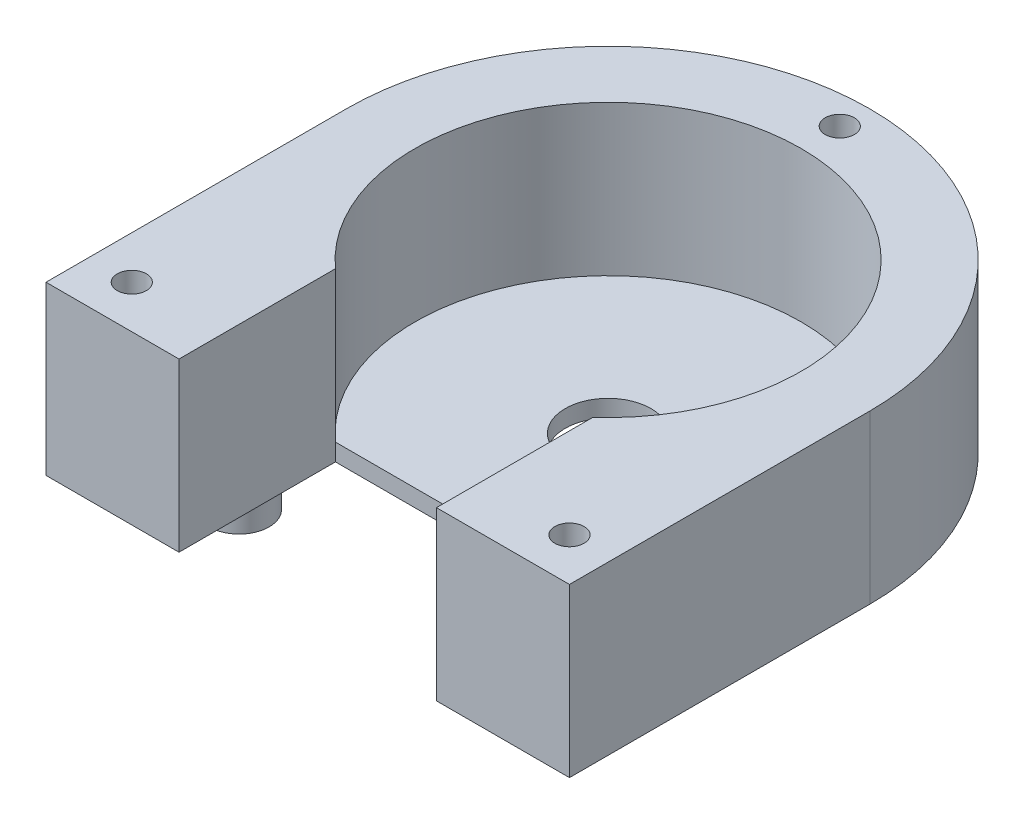
ISO-10303-21;
HEADER;
FILE_DESCRIPTION(('STEP AP214'),'2;1');
FILE_NAME('part.step','',(''),(''),'','','');
FILE_SCHEMA(('AUTOMOTIVE_DESIGN { 1 0 10303 214 1 1 1 1 }'));
ENDSEC;
DATA;
#1=APPLICATION_CONTEXT('core data for automotive mechanical design processes');
#2=APPLICATION_PROTOCOL_DEFINITION('international standard','automotive_design',2000,#1);
#3=PRODUCT_CONTEXT('',#1,'mechanical');
#4=PRODUCT('Part','Part','',(#3));
#5=PRODUCT_RELATED_PRODUCT_CATEGORY('part','',(#4));
#6=PRODUCT_DEFINITION_FORMATION('','',#4);
#7=PRODUCT_DEFINITION_CONTEXT('part definition',#1,'design');
#8=PRODUCT_DEFINITION('design','',#6,#7);
#9=PRODUCT_DEFINITION_SHAPE('','',#8);
#10=(LENGTH_UNIT() NAMED_UNIT(*) SI_UNIT(.MILLI.,.METRE.));
#11=(NAMED_UNIT(*) PLANE_ANGLE_UNIT() SI_UNIT($,.RADIAN.));
#12=(NAMED_UNIT(*) SI_UNIT($,.STERADIAN.) SOLID_ANGLE_UNIT());
#13=UNCERTAINTY_MEASURE_WITH_UNIT(LENGTH_MEASURE(1.E-05),#10,'distance_accuracy_value','');
#14=(GEOMETRIC_REPRESENTATION_CONTEXT(3) GLOBAL_UNCERTAINTY_ASSIGNED_CONTEXT((#13)) GLOBAL_UNIT_ASSIGNED_CONTEXT((#10,
#11,#12)) REPRESENTATION_CONTEXT('',''));
#15=CARTESIAN_POINT('',(0.,0.,0.));
#16=DIRECTION('',(0.,0.,1.));
#17=DIRECTION('',(1.,0.,0.));
#18=AXIS2_PLACEMENT_3D('',#15,#16,#17);
#19=CARTESIAN_POINT('',(0.,0.,0.));
#20=DIRECTION('',(0.,1.,0.));
#21=DIRECTION('',(0.,0.,1.));
#22=AXIS2_PLACEMENT_3D('',#19,#20,#21);
#23=PLANE('',#22);
#24=CARTESIAN_POINT('',(0.,0.,-27.));
#25=DIRECTION('',(0.,1.,0.));
#26=DIRECTION('',(0.,0.,1.));
#27=AXIS2_PLACEMENT_3D('',#24,#25,#26);
#28=CIRCLE('',#27,1.7);
#29=CARTESIAN_POINT('',(0.,0.,-25.3));
#30=VERTEX_POINT('',#29);
#31=EDGE_CURVE('E656',#30,#30,#28,.F.);
#32=ORIENTED_EDGE('',*,*,#31,.T.);
#33=EDGE_LOOP('',(#32));
#34=FACE_BOUND('',#33,.T.);
#35=CARTESIAN_POINT('',(25.5,0.,30.));
#36=DIRECTION('',(0.,1.,0.));
#37=DIRECTION('',(0.,0.,1.));
#38=AXIS2_PLACEMENT_3D('',#35,#36,#37);
#39=CIRCLE('',#38,1.7);
#40=CARTESIAN_POINT('',(25.5,0.,31.7));
#41=VERTEX_POINT('',#40);
#42=EDGE_CURVE('E669',#41,#41,#39,.F.);
#43=ORIENTED_EDGE('',*,*,#42,.T.);
#44=EDGE_LOOP('',(#43));
#45=FACE_BOUND('',#44,.T.);
#46=DIRECTION('',(0.,0.,1.));
#47=VECTOR('',#46,1.);
#48=CARTESIAN_POINT('',(15.,0.,0.));
#49=LINE('',#48,#47);
#50=CARTESIAN_POINT('',(15.,0.,16.7705098312484));
#51=VERTEX_POINT('',#50);
#52=CARTESIAN_POINT('',(15.,0.,35.));
#53=VERTEX_POINT('',#52);
#54=EDGE_CURVE('E238',#51,#53,#49,.T.);
#55=ORIENTED_EDGE('',*,*,#54,.T.);
#56=DIRECTION('',(-1.,0.,0.));
#57=VECTOR('',#56,1.);
#58=CARTESIAN_POINT('',(0.,0.,35.));
#59=LINE('',#58,#57);
#60=CARTESIAN_POINT('',(30.5,0.,35.));
#61=VERTEX_POINT('',#60);
#62=EDGE_CURVE('E230',#61,#53,#59,.T.);
#63=ORIENTED_EDGE('',*,*,#62,.F.);
#64=DIRECTION('',(0.,0.,1.));
#65=VECTOR('',#64,1.);
#66=CARTESIAN_POINT('',(30.5,0.,0.));
#67=LINE('',#66,#65);
#68=CARTESIAN_POINT('',(30.5,0.,0.));
#69=VERTEX_POINT('',#68);
#70=EDGE_CURVE('E237',#69,#61,#67,.T.);
#71=ORIENTED_EDGE('',*,*,#70,.F.);
#72=CARTESIAN_POINT('',(0.,0.,0.));
#73=DIRECTION('',(0.,1.,0.));
#74=DIRECTION('',(0.,0.,1.));
#75=AXIS2_PLACEMENT_3D('',#72,#73,#74);
#76=CIRCLE('',#75,30.5);
#77=CARTESIAN_POINT('',(-30.5,0.,0.));
#78=VERTEX_POINT('',#77);
#79=EDGE_CURVE('E249',#69,#78,#76,.T.);
#80=ORIENTED_EDGE('',*,*,#79,.T.);
#81=DIRECTION('',(0.,0.,-1.));
#82=VECTOR('',#81,1.);
#83=CARTESIAN_POINT('',(-30.5,0.,0.));
#84=LINE('',#83,#82);
#85=CARTESIAN_POINT('',(-30.5,0.,35.));
#86=VERTEX_POINT('',#85);
#87=EDGE_CURVE('E123',#86,#78,#84,.T.);
#88=ORIENTED_EDGE('',*,*,#87,.F.);
#89=DIRECTION('',(-1.,0.,0.));
#90=VECTOR('',#89,1.);
#91=CARTESIAN_POINT('',(0.,0.,35.));
#92=LINE('',#91,#90);
#93=CARTESIAN_POINT('',(-15.,0.,35.));
#94=VERTEX_POINT('',#93);
#95=EDGE_CURVE('E119',#94,#86,#92,.T.);
#96=ORIENTED_EDGE('',*,*,#95,.F.);
#97=DIRECTION('',(0.,0.,1.));
#98=VECTOR('',#97,1.);
#99=CARTESIAN_POINT('',(-15.,0.,0.));
#100=LINE('',#99,#98);
#101=CARTESIAN_POINT('',(-15.,0.,16.7705098312484));
#102=VERTEX_POINT('',#101);
#103=EDGE_CURVE('E102',#102,#94,#100,.T.);
#104=ORIENTED_EDGE('',*,*,#103,.F.);
#105=CARTESIAN_POINT('',(0.,0.,0.));
#106=DIRECTION('',(0.,1.,0.));
#107=DIRECTION('',(0.,0.,1.));
#108=AXIS2_PLACEMENT_3D('',#105,#106,#107);
#109=CIRCLE('',#108,22.5);
#110=EDGE_CURVE('E92',#51,#102,#109,.T.);
#111=ORIENTED_EDGE('',*,*,#110,.F.);
#112=EDGE_LOOP('',(#55,#63,#71,#80,#88,#96,#104,#111));
#113=FACE_BOUND('',#112,.T.);
#114=CARTESIAN_POINT('',(-25.5000000000002,0.,30.));
#115=DIRECTION('',(0.,1.,0.));
#116=DIRECTION('',(0.,0.,1.));
#117=AXIS2_PLACEMENT_3D('',#114,#115,#116);
#118=CIRCLE('',#117,1.7);
#119=CARTESIAN_POINT('',(-25.5000000000002,0.,31.7));
#120=VERTEX_POINT('',#119);
#121=EDGE_CURVE('E686',#120,#120,#118,.F.);
#122=ORIENTED_EDGE('',*,*,#121,.T.);
#123=EDGE_LOOP('',(#122));
#124=FACE_BOUND('',#123,.T.);
#125=ADVANCED_FACE('F46',(#34,#45,#113,#124),#23,.T.);
#126=CARTESIAN_POINT('',(0.,-19.5,0.));
#127=DIRECTION('',(0.,-1.,0.));
#128=DIRECTION('',(0.,0.,-1.));
#129=AXIS2_PLACEMENT_3D('',#126,#127,#128);
#130=PLANE('',#129);
#131=CARTESIAN_POINT('',(0.,-19.5,-27.));
#132=DIRECTION('',(0.,-1.,0.));
#133=DIRECTION('',(0.,0.,-1.));
#134=AXIS2_PLACEMENT_3D('',#131,#132,#133);
#135=CIRCLE('',#134,3.25);
#136=CARTESIAN_POINT('',(0.,-19.5,-30.25));
#137=VERTEX_POINT('',#136);
#138=EDGE_CURVE('E654',#137,#137,#135,.T.);
#139=ORIENTED_EDGE('',*,*,#138,.F.);
#140=EDGE_LOOP('',(#139));
#141=FACE_BOUND('',#140,.T.);
#142=CARTESIAN_POINT('',(25.5,-19.5,30.));
#143=DIRECTION('',(0.,-1.,0.));
#144=DIRECTION('',(0.,0.,-1.));
#145=AXIS2_PLACEMENT_3D('',#142,#143,#144);
#146=CIRCLE('',#145,3.25);
#147=CARTESIAN_POINT('',(25.5,-19.5,26.75));
#148=VERTEX_POINT('',#147);
#149=EDGE_CURVE('E674',#148,#148,#146,.T.);
#150=ORIENTED_EDGE('',*,*,#149,.F.);
#151=EDGE_LOOP('',(#150));
#152=FACE_BOUND('',#151,.T.);
#153=CARTESIAN_POINT('',(-25.5000000000002,-19.5,30.));
#154=DIRECTION('',(0.,-1.,0.));
#155=DIRECTION('',(0.,0.,-1.));
#156=AXIS2_PLACEMENT_3D('',#153,#154,#155);
#157=CIRCLE('',#156,3.25);
#158=CARTESIAN_POINT('',(-25.5000000000002,-19.5,26.75));
#159=VERTEX_POINT('',#158);
#160=EDGE_CURVE('E673',#159,#159,#157,.T.);
#161=ORIENTED_EDGE('',*,*,#160,.F.);
#162=EDGE_LOOP('',(#161));
#163=FACE_BOUND('',#162,.T.);
#164=CARTESIAN_POINT('',(-19.9999999999999,-19.5,-15.0000000000002));
#165=DIRECTION('',(0.,-1.,0.));
#166=DIRECTION('',(0.,0.,-1.));
#167=AXIS2_PLACEMENT_3D('',#164,#165,#166);
#168=CIRCLE('',#167,3.50000000000001);
#169=CARTESIAN_POINT('',(-19.9999999999999,-19.5,-18.5000000000002));
#170=VERTEX_POINT('',#169);
#171=EDGE_CURVE('E11',#170,#170,#168,.T.);
#172=ORIENTED_EDGE('',*,*,#171,.F.);
#173=EDGE_LOOP('',(#172));
#174=FACE_BOUND('',#173,.T.);
#175=CARTESIAN_POINT('',(20.,-19.5,23.));
#176=DIRECTION('',(0.,-1.,0.));
#177=DIRECTION('',(0.,0.,-1.));
#178=AXIS2_PLACEMENT_3D('',#175,#176,#177);
#179=CIRCLE('',#178,3.5);
#180=CARTESIAN_POINT('',(20.,-19.5,19.5));
#181=VERTEX_POINT('',#180);
#182=EDGE_CURVE('E702',#181,#181,#179,.T.);
#183=ORIENTED_EDGE('',*,*,#182,.F.);
#184=EDGE_LOOP('',(#183));
#185=FACE_BOUND('',#184,.T.);
#186=CARTESIAN_POINT('',(-20.0000000000002,-19.5,23.));
#187=DIRECTION('',(0.,-1.,0.));
#188=DIRECTION('',(0.,0.,-1.));
#189=AXIS2_PLACEMENT_3D('',#186,#187,#188);
#190=CIRCLE('',#189,3.50000000000001);
#191=CARTESIAN_POINT('',(-20.0000000000002,-19.5,19.5));
#192=VERTEX_POINT('',#191);
#193=EDGE_CURVE('E128',#192,#192,#190,.T.);
#194=ORIENTED_EDGE('',*,*,#193,.F.);
#195=EDGE_LOOP('',(#194));
#196=FACE_BOUND('',#195,.T.);
#197=CARTESIAN_POINT('',(0.,-19.5,0.));
#198=DIRECTION('',(0.,-1.,0.));
#199=DIRECTION('',(0.,0.,-1.));
#200=AXIS2_PLACEMENT_3D('',#197,#198,#199);
#201=CIRCLE('',#200,5.);
#202=CARTESIAN_POINT('',(0.,-19.5,-5.));
#203=VERTEX_POINT('',#202);
#204=EDGE_CURVE('E306',#203,#203,#201,.T.);
#205=ORIENTED_EDGE('',*,*,#204,.F.);
#206=EDGE_LOOP('',(#205));
#207=FACE_BOUND('',#206,.T.);
#208=DIRECTION('',(1.,0.,0.));
#209=VECTOR('',#208,1.);
#210=CARTESIAN_POINT('',(0.,-19.5,16.7705098312484));
#211=LINE('',#210,#209);
#212=CARTESIAN_POINT('',(-15.,-19.5,16.7705098312484));
#213=VERTEX_POINT('',#212);
#214=CARTESIAN_POINT('',(15.,-19.5,16.7705098312484));
#215=VERTEX_POINT('',#214);
#216=EDGE_CURVE('E311',#213,#215,#211,.T.);
#217=ORIENTED_EDGE('',*,*,#216,.F.);
#218=DIRECTION('',(0.,0.,1.));
#219=VECTOR('',#218,1.);
#220=CARTESIAN_POINT('',(-15.,-19.5,0.));
#221=LINE('',#220,#219);
#222=CARTESIAN_POINT('',(-15.,-19.5,35.));
#223=VERTEX_POINT('',#222);
#224=EDGE_CURVE('E283',#213,#223,#221,.T.);
#225=ORIENTED_EDGE('',*,*,#224,.T.);
#226=DIRECTION('',(-1.,0.,0.));
#227=VECTOR('',#226,1.);
#228=CARTESIAN_POINT('',(0.,-19.5,35.));
#229=LINE('',#228,#227);
#230=CARTESIAN_POINT('',(-30.5,-19.5,35.));
#231=VERTEX_POINT('',#230);
#232=EDGE_CURVE('E279',#223,#231,#229,.T.);
#233=ORIENTED_EDGE('',*,*,#232,.T.);
#234=DIRECTION('',(0.,0.,-1.));
#235=VECTOR('',#234,1.);
#236=CARTESIAN_POINT('',(-30.5,-19.5,0.));
#237=LINE('',#236,#235);
#238=CARTESIAN_POINT('',(-30.5,-19.5,0.));
#239=VERTEX_POINT('',#238);
#240=EDGE_CURVE('E272',#231,#239,#237,.T.);
#241=ORIENTED_EDGE('',*,*,#240,.T.);
#242=CARTESIAN_POINT('',(0.,-19.5,0.));
#243=DIRECTION('',(0.,-1.,0.));
#244=DIRECTION('',(0.,0.,-1.));
#245=AXIS2_PLACEMENT_3D('',#242,#243,#244);
#246=CIRCLE('',#245,30.5);
#247=CARTESIAN_POINT('',(30.5,-19.5,0.));
#248=VERTEX_POINT('',#247);
#249=EDGE_CURVE('E264',#239,#248,#246,.T.);
#250=ORIENTED_EDGE('',*,*,#249,.T.);
#251=DIRECTION('',(0.,0.,1.));
#252=VECTOR('',#251,1.);
#253=CARTESIAN_POINT('',(30.5,-19.5,0.));
#254=LINE('',#253,#252);
#255=CARTESIAN_POINT('',(30.5,-19.5,35.));
#256=VERTEX_POINT('',#255);
#257=EDGE_CURVE('E271',#248,#256,#254,.T.);
#258=ORIENTED_EDGE('',*,*,#257,.T.);
#259=DIRECTION('',(-1.,0.,0.));
#260=VECTOR('',#259,1.);
#261=CARTESIAN_POINT('',(0.,-19.5,35.));
#262=LINE('',#261,#260);
#263=CARTESIAN_POINT('',(15.,-19.5,35.));
#264=VERTEX_POINT('',#263);
#265=EDGE_CURVE('E289',#256,#264,#262,.T.);
#266=ORIENTED_EDGE('',*,*,#265,.T.);
#267=DIRECTION('',(0.,0.,-1.));
#268=VECTOR('',#267,1.);
#269=CARTESIAN_POINT('',(15.,-19.5,0.));
#270=LINE('',#269,#268);
#271=EDGE_CURVE('E293',#264,#215,#270,.T.);
#272=ORIENTED_EDGE('',*,*,#271,.T.);
#273=EDGE_LOOP('',(#217,#225,#233,#241,#250,#258,#266,#272));
#274=FACE_BOUND('',#273,.T.);
#275=CARTESIAN_POINT('',(20.,-19.5,-15.));
#276=DIRECTION('',(0.,-1.,0.));
#277=DIRECTION('',(0.,0.,-1.));
#278=AXIS2_PLACEMENT_3D('',#275,#276,#277);
#279=CIRCLE('',#278,3.5);
#280=CARTESIAN_POINT('',(20.,-19.5,-18.5));
#281=VERTEX_POINT('',#280);
#282=EDGE_CURVE('E715',#281,#281,#279,.T.);
#283=ORIENTED_EDGE('',*,*,#282,.F.);
#284=EDGE_LOOP('',(#283));
#285=FACE_BOUND('',#284,.T.);
#286=ADVANCED_FACE('F167',(#141,#152,#163,#174,#185,#196,#207,#274,#285),#130,.T.);
#287=CARTESIAN_POINT('',(15.,-17.5,0.));
#288=DIRECTION('',(-1.,0.,0.));
#289=DIRECTION('',(0.,0.,1.));
#290=AXIS2_PLACEMENT_3D('',#287,#288,#289);
#291=PLANE('',#290);
#292=ORIENTED_EDGE('',*,*,#54,.F.);
#293=DIRECTION('',(0.,1.,0.));
#294=VECTOR('',#293,1.);
#295=CARTESIAN_POINT('',(15.,-17.5,16.7705098312484));
#296=LINE('',#295,#294);
#297=CARTESIAN_POINT('',(15.,-17.5,16.7705098312484));
#298=VERTEX_POINT('',#297);
#299=EDGE_CURVE('E63',#298,#51,#296,.T.);
#300=ORIENTED_EDGE('',*,*,#299,.F.);
#301=DIRECTION('',(0.,1.,0.));
#302=VECTOR('',#301,1.);
#303=CARTESIAN_POINT('',(15.,-19.5,16.7705098312484));
#304=LINE('',#303,#302);
#305=EDGE_CURVE('E243',#215,#298,#304,.T.);
#306=ORIENTED_EDGE('',*,*,#305,.F.);
#307=ORIENTED_EDGE('',*,*,#271,.F.);
#308=DIRECTION('',(0.,1.,0.));
#309=VECTOR('',#308,1.);
#310=CARTESIAN_POINT('',(15.,-17.5,35.));
#311=LINE('',#310,#309);
#312=EDGE_CURVE('E146',#264,#53,#311,.T.);
#313=ORIENTED_EDGE('',*,*,#312,.T.);
#314=EDGE_LOOP('',(#292,#300,#306,#307,#313));
#315=FACE_BOUND('',#314,.T.);
#316=ADVANCED_FACE('F48',(#315),#291,.T.);
#317=CARTESIAN_POINT('',(0.,-17.5,0.));
#318=DIRECTION('',(0.,1.,0.));
#319=DIRECTION('',(0.,0.,1.));
#320=AXIS2_PLACEMENT_3D('',#317,#318,#319);
#321=CYLINDRICAL_SURFACE('',#320,22.5);
#322=ORIENTED_EDGE('',*,*,#110,.T.);
#323=DIRECTION('',(0.,1.,0.));
#324=VECTOR('',#323,1.);
#325=CARTESIAN_POINT('',(-15.,-17.5,16.7705098312484));
#326=LINE('',#325,#324);
#327=CARTESIAN_POINT('',(-15.,-17.5,16.7705098312484));
#328=VERTEX_POINT('',#327);
#329=EDGE_CURVE('E95',#328,#102,#326,.T.);
#330=ORIENTED_EDGE('',*,*,#329,.F.);
#331=CARTESIAN_POINT('',(0.,-17.5,0.));
#332=DIRECTION('',(0.,1.,0.));
#333=DIRECTION('',(0.,0.,1.));
#334=AXIS2_PLACEMENT_3D('',#331,#332,#333);
#335=CIRCLE('',#334,22.5);
#336=EDGE_CURVE('E101',#298,#328,#335,.T.);
#337=ORIENTED_EDGE('',*,*,#336,.F.);
#338=ORIENTED_EDGE('',*,*,#299,.T.);
#339=EDGE_LOOP('',(#322,#330,#337,#338));
#340=FACE_BOUND('',#339,.T.);
#341=ADVANCED_FACE('F94',(#340),#321,.F.);
#342=CARTESIAN_POINT('',(-15.,-17.5,0.));
#343=DIRECTION('',(-1.,0.,0.));
#344=DIRECTION('',(0.,0.,1.));
#345=AXIS2_PLACEMENT_3D('',#342,#343,#344);
#346=PLANE('',#345);
#347=ORIENTED_EDGE('',*,*,#103,.T.);
#348=DIRECTION('',(0.,1.,0.));
#349=VECTOR('',#348,1.);
#350=CARTESIAN_POINT('',(-15.,-17.5,35.));
#351=LINE('',#350,#349);
#352=EDGE_CURVE('E114',#223,#94,#351,.T.);
#353=ORIENTED_EDGE('',*,*,#352,.F.);
#354=ORIENTED_EDGE('',*,*,#224,.F.);
#355=DIRECTION('',(0.,1.,0.));
#356=VECTOR('',#355,1.);
#357=CARTESIAN_POINT('',(-15.,-19.5,16.7705098312484));
#358=LINE('',#357,#356);
#359=EDGE_CURVE('E111',#213,#328,#358,.T.);
#360=ORIENTED_EDGE('',*,*,#359,.T.);
#361=ORIENTED_EDGE('',*,*,#329,.T.);
#362=EDGE_LOOP('',(#347,#353,#354,#360,#361));
#363=FACE_BOUND('',#362,.T.);
#364=ADVANCED_FACE('F106',(#363),#346,.F.);
#365=CARTESIAN_POINT('',(0.,-17.5,35.));
#366=DIRECTION('',(0.,0.,-1.));
#367=DIRECTION('',(-1.,0.,0.));
#368=AXIS2_PLACEMENT_3D('',#365,#366,#367);
#369=PLANE('',#368);
#370=ORIENTED_EDGE('',*,*,#95,.T.);
#371=DIRECTION('',(0.,1.,0.));
#372=VECTOR('',#371,1.);
#373=CARTESIAN_POINT('',(-30.5,-17.5,35.));
#374=LINE('',#373,#372);
#375=EDGE_CURVE('E132',#231,#86,#374,.T.);
#376=ORIENTED_EDGE('',*,*,#375,.F.);
#377=ORIENTED_EDGE('',*,*,#232,.F.);
#378=ORIENTED_EDGE('',*,*,#352,.T.);
#379=EDGE_LOOP('',(#370,#376,#377,#378));
#380=FACE_BOUND('',#379,.T.);
#381=ADVANCED_FACE('F203',(#380),#369,.F.);
#382=CARTESIAN_POINT('',(-30.5,-17.5,0.));
#383=DIRECTION('',(1.,0.,0.));
#384=DIRECTION('',(0.,0.,-1.));
#385=AXIS2_PLACEMENT_3D('',#382,#383,#384);
#386=PLANE('',#385);
#387=ORIENTED_EDGE('',*,*,#87,.T.);
#388=DIRECTION('',(0.,1.,0.));
#389=VECTOR('',#388,1.);
#390=CARTESIAN_POINT('',(-30.5,-17.5,0.));
#391=LINE('',#390,#389);
#392=EDGE_CURVE('E136',#239,#78,#391,.T.);
#393=ORIENTED_EDGE('',*,*,#392,.F.);
#394=ORIENTED_EDGE('',*,*,#240,.F.);
#395=ORIENTED_EDGE('',*,*,#375,.T.);
#396=EDGE_LOOP('',(#387,#393,#394,#395));
#397=FACE_BOUND('',#396,.T.);
#398=ADVANCED_FACE('F206',(#397),#386,.F.);
#399=CARTESIAN_POINT('',(0.,-17.5,0.));
#400=DIRECTION('',(0.,1.,0.));
#401=DIRECTION('',(0.,0.,1.));
#402=AXIS2_PLACEMENT_3D('',#399,#400,#401);
#403=CYLINDRICAL_SURFACE('',#402,30.5);
#404=ORIENTED_EDGE('',*,*,#79,.F.);
#405=DIRECTION('',(0.,1.,0.));
#406=VECTOR('',#405,1.);
#407=CARTESIAN_POINT('',(30.5,-17.5,0.));
#408=LINE('',#407,#406);
#409=EDGE_CURVE('E139',#248,#69,#408,.T.);
#410=ORIENTED_EDGE('',*,*,#409,.F.);
#411=ORIENTED_EDGE('',*,*,#249,.F.);
#412=ORIENTED_EDGE('',*,*,#392,.T.);
#413=EDGE_LOOP('',(#404,#410,#411,#412));
#414=FACE_BOUND('',#413,.T.);
#415=ADVANCED_FACE('F210',(#414),#403,.T.);
#416=CARTESIAN_POINT('',(30.5,-17.5,0.));
#417=DIRECTION('',(-1.,0.,0.));
#418=DIRECTION('',(0.,0.,1.));
#419=AXIS2_PLACEMENT_3D('',#416,#417,#418);
#420=PLANE('',#419);
#421=ORIENTED_EDGE('',*,*,#70,.T.);
#422=DIRECTION('',(0.,1.,0.));
#423=VECTOR('',#422,1.);
#424=CARTESIAN_POINT('',(30.5,-17.5,35.));
#425=LINE('',#424,#423);
#426=EDGE_CURVE('E142',#256,#61,#425,.T.);
#427=ORIENTED_EDGE('',*,*,#426,.F.);
#428=ORIENTED_EDGE('',*,*,#257,.F.);
#429=ORIENTED_EDGE('',*,*,#409,.T.);
#430=EDGE_LOOP('',(#421,#427,#428,#429));
#431=FACE_BOUND('',#430,.T.);
#432=ADVANCED_FACE('F214',(#431),#420,.F.);
#433=CARTESIAN_POINT('',(0.,-17.5,35.));
#434=DIRECTION('',(0.,0.,-1.));
#435=DIRECTION('',(-1.,0.,0.));
#436=AXIS2_PLACEMENT_3D('',#433,#434,#435);
#437=PLANE('',#436);
#438=ORIENTED_EDGE('',*,*,#62,.T.);
#439=ORIENTED_EDGE('',*,*,#312,.F.);
#440=ORIENTED_EDGE('',*,*,#265,.F.);
#441=ORIENTED_EDGE('',*,*,#426,.T.);
#442=EDGE_LOOP('',(#438,#439,#440,#441));
#443=FACE_BOUND('',#442,.T.);
#444=ADVANCED_FACE('F217',(#443),#437,.F.);
#445=CARTESIAN_POINT('',(0.,-17.5,0.));
#446=DIRECTION('',(0.,-1.,0.));
#447=DIRECTION('',(0.,0.,-1.));
#448=AXIS2_PLACEMENT_3D('',#445,#446,#447);
#449=PLANE('',#448);
#450=CARTESIAN_POINT('',(0.,-17.5,0.));
#451=DIRECTION('',(0.,-1.,0.));
#452=DIRECTION('',(0.,0.,-1.));
#453=AXIS2_PLACEMENT_3D('',#450,#451,#452);
#454=CIRCLE('',#453,5.);
#455=CARTESIAN_POINT('',(0.,-17.5,-5.));
#456=VERTEX_POINT('',#455);
#457=EDGE_CURVE('E297',#456,#456,#454,.T.);
#458=ORIENTED_EDGE('',*,*,#457,.T.);
#459=EDGE_LOOP('',(#458));
#460=FACE_BOUND('',#459,.T.);
#461=DIRECTION('',(1.,0.,0.));
#462=VECTOR('',#461,1.);
#463=CARTESIAN_POINT('',(0.,-17.5,16.7705098312484));
#464=LINE('',#463,#462);
#465=EDGE_CURVE('E301',#328,#298,#464,.T.);
#466=ORIENTED_EDGE('',*,*,#465,.T.);
#467=ORIENTED_EDGE('',*,*,#336,.T.);
#468=EDGE_LOOP('',(#466,#467));
#469=FACE_BOUND('',#468,.T.);
#470=ADVANCED_FACE('F220',(#460,#469),#449,.F.);
#471=CARTESIAN_POINT('',(0.,-19.5,16.7705098312484));
#472=DIRECTION('',(0.,0.,1.));
#473=DIRECTION('',(1.,0.,0.));
#474=AXIS2_PLACEMENT_3D('',#471,#472,#473);
#475=PLANE('',#474);
#476=ORIENTED_EDGE('',*,*,#465,.F.);
#477=ORIENTED_EDGE('',*,*,#359,.F.);
#478=ORIENTED_EDGE('',*,*,#216,.T.);
#479=ORIENTED_EDGE('',*,*,#305,.T.);
#480=EDGE_LOOP('',(#476,#477,#478,#479));
#481=FACE_BOUND('',#480,.T.);
#482=ADVANCED_FACE('F225',(#481),#475,.T.);
#483=CARTESIAN_POINT('',(0.,-19.5,0.));
#484=DIRECTION('',(0.,1.,0.));
#485=DIRECTION('',(0.,0.,1.));
#486=AXIS2_PLACEMENT_3D('',#483,#484,#485);
#487=CYLINDRICAL_SURFACE('',#486,5.);
#488=ORIENTED_EDGE('',*,*,#204,.T.);
#489=EDGE_LOOP('',(#488));
#490=FACE_BOUND('',#489,.T.);
#491=ORIENTED_EDGE('',*,*,#457,.F.);
#492=EDGE_LOOP('',(#491));
#493=FACE_BOUND('',#492,.T.);
#494=ADVANCED_FACE('F197',(#490,#493),#487,.F.);
#495=CARTESIAN_POINT('',(-20.0000000000002,-23.7,23.));
#496=DIRECTION('',(0.,1.,0.));
#497=DIRECTION('',(0.,0.,1.));
#498=AXIS2_PLACEMENT_3D('',#495,#496,#497);
#499=CYLINDRICAL_SURFACE('',#498,3.50000000000001);
#500=CARTESIAN_POINT('',(-20.0000000000002,-23.7,23.));
#501=DIRECTION('',(0.,-1.,0.));
#502=DIRECTION('',(0.,0.,-1.));
#503=AXIS2_PLACEMENT_3D('',#500,#501,#502);
#504=CIRCLE('',#503,3.50000000000001);
#505=CARTESIAN_POINT('',(-20.0000000000002,-23.7,19.5));
#506=VERTEX_POINT('',#505);
#507=EDGE_CURVE('E733',#506,#506,#504,.F.);
#508=ORIENTED_EDGE('',*,*,#507,.T.);
#509=EDGE_LOOP('',(#508));
#510=FACE_BOUND('',#509,.T.);
#511=ORIENTED_EDGE('',*,*,#193,.T.);
#512=EDGE_LOOP('',(#511));
#513=FACE_BOUND('',#512,.T.);
#514=ADVANCED_FACE('F395',(#510,#513),#499,.T.);
#515=CARTESIAN_POINT('',(-20.0000000000002,-23.7,23.));
#516=DIRECTION('',(0.,1.,0.));
#517=DIRECTION('',(0.,0.,1.));
#518=AXIS2_PLACEMENT_3D('',#515,#516,#517);
#519=CYLINDRICAL_SURFACE('',#518,1.60000000000001);
#520=CARTESIAN_POINT('',(-20.0000000000002,-23.7,23.));
#521=DIRECTION('',(0.,-1.,0.));
#522=DIRECTION('',(0.,0.,-1.));
#523=AXIS2_PLACEMENT_3D('',#520,#521,#522);
#524=CIRCLE('',#523,1.60000000000001);
#525=CARTESIAN_POINT('',(-20.0000000000002,-23.7,21.4));
#526=VERTEX_POINT('',#525);
#527=EDGE_CURVE('E302',#526,#526,#524,.F.);
#528=ORIENTED_EDGE('',*,*,#527,.F.);
#529=EDGE_LOOP('',(#528));
#530=FACE_BOUND('',#529,.T.);
#531=CARTESIAN_POINT('',(-20.0000000000002,-19.5,23.));
#532=DIRECTION('',(0.,-1.,0.));
#533=DIRECTION('',(0.,0.,-1.));
#534=AXIS2_PLACEMENT_3D('',#531,#532,#533);
#535=CIRCLE('',#534,1.60000000000001);
#536=CARTESIAN_POINT('',(-20.0000000000002,-19.5,21.4));
#537=VERTEX_POINT('',#536);
#538=EDGE_CURVE('E706',#537,#537,#535,.F.);
#539=ORIENTED_EDGE('',*,*,#538,.T.);
#540=EDGE_LOOP('',(#539));
#541=FACE_BOUND('',#540,.T.);
#542=ADVANCED_FACE('F453',(#530,#541),#519,.F.);
#543=CARTESIAN_POINT('',(0.,-23.7,0.));
#544=DIRECTION('',(0.,-1.,0.));
#545=DIRECTION('',(0.,0.,-1.));
#546=AXIS2_PLACEMENT_3D('',#543,#544,#545);
#547=PLANE('',#546);
#548=ORIENTED_EDGE('',*,*,#507,.F.);
#549=EDGE_LOOP('',(#548));
#550=FACE_BOUND('',#549,.T.);
#551=ORIENTED_EDGE('',*,*,#527,.T.);
#552=EDGE_LOOP('',(#551));
#553=FACE_BOUND('',#552,.T.);
#554=ADVANCED_FACE('F462',(#550,#553),#547,.T.);
#555=CARTESIAN_POINT('',(20.,-23.7,23.));
#556=DIRECTION('',(0.,1.,0.));
#557=DIRECTION('',(0.,0.,1.));
#558=AXIS2_PLACEMENT_3D('',#555,#556,#557);
#559=CYLINDRICAL_SURFACE('',#558,1.6);
#560=CARTESIAN_POINT('',(20.,-23.7,23.));
#561=DIRECTION('',(0.,-1.,0.));
#562=DIRECTION('',(0.,0.,-1.));
#563=AXIS2_PLACEMENT_3D('',#560,#561,#562);
#564=CIRCLE('',#563,1.6);
#565=CARTESIAN_POINT('',(20.,-23.7,21.4));
#566=VERTEX_POINT('',#565);
#567=EDGE_CURVE('E697',#566,#566,#564,.T.);
#568=ORIENTED_EDGE('',*,*,#567,.T.);
#569=EDGE_LOOP('',(#568));
#570=FACE_BOUND('',#569,.T.);
#571=CARTESIAN_POINT('',(20.,-19.5,23.));
#572=DIRECTION('',(0.,-1.,0.));
#573=DIRECTION('',(0.,0.,-1.));
#574=AXIS2_PLACEMENT_3D('',#571,#572,#573);
#575=CIRCLE('',#574,1.6);
#576=CARTESIAN_POINT('',(20.,-19.5,21.4));
#577=VERTEX_POINT('',#576);
#578=EDGE_CURVE('E152',#577,#577,#575,.F.);
#579=ORIENTED_EDGE('',*,*,#578,.T.);
#580=EDGE_LOOP('',(#579));
#581=FACE_BOUND('',#580,.T.);
#582=ADVANCED_FACE('F472',(#570,#581),#559,.F.);
#583=CARTESIAN_POINT('',(20.,-23.7,23.));
#584=DIRECTION('',(0.,1.,0.));
#585=DIRECTION('',(0.,0.,1.));
#586=AXIS2_PLACEMENT_3D('',#583,#584,#585);
#587=CYLINDRICAL_SURFACE('',#586,3.5);
#588=CARTESIAN_POINT('',(20.,-23.7,23.));
#589=DIRECTION('',(0.,-1.,0.));
#590=DIRECTION('',(0.,0.,-1.));
#591=AXIS2_PLACEMENT_3D('',#588,#589,#590);
#592=CIRCLE('',#591,3.5);
#593=CARTESIAN_POINT('',(20.,-23.7,19.5));
#594=VERTEX_POINT('',#593);
#595=EDGE_CURVE('E701',#594,#594,#592,.T.);
#596=ORIENTED_EDGE('',*,*,#595,.F.);
#597=EDGE_LOOP('',(#596));
#598=FACE_BOUND('',#597,.T.);
#599=ORIENTED_EDGE('',*,*,#182,.T.);
#600=EDGE_LOOP('',(#599));
#601=FACE_BOUND('',#600,.T.);
#602=ADVANCED_FACE('F482',(#598,#601),#587,.T.);
#603=CARTESIAN_POINT('',(0.,-23.7,0.));
#604=DIRECTION('',(0.,-1.,0.));
#605=DIRECTION('',(0.,0.,-1.));
#606=AXIS2_PLACEMENT_3D('',#603,#604,#605);
#607=PLANE('',#606);
#608=ORIENTED_EDGE('',*,*,#567,.F.);
#609=EDGE_LOOP('',(#608));
#610=FACE_BOUND('',#609,.T.);
#611=ORIENTED_EDGE('',*,*,#595,.T.);
#612=EDGE_LOOP('',(#611));
#613=FACE_BOUND('',#612,.T.);
#614=ADVANCED_FACE('F405',(#610,#613),#607,.T.);
#615=ORIENTED_EDGE('',*,*,#578,.F.);
#616=EDGE_LOOP('',(#615));
#617=FACE_BOUND('',#616,.T.);
#618=ADVANCED_FACE('F178',(#617),#130,.T.);
#619=CARTESIAN_POINT('',(20.,-23.7,-15.));
#620=DIRECTION('',(0.,1.,0.));
#621=DIRECTION('',(0.,0.,1.));
#622=AXIS2_PLACEMENT_3D('',#619,#620,#621);
#623=CYLINDRICAL_SURFACE('',#622,1.6);
#624=CARTESIAN_POINT('',(20.,-23.7,-15.));
#625=DIRECTION('',(0.,-1.,0.));
#626=DIRECTION('',(0.,0.,-1.));
#627=AXIS2_PLACEMENT_3D('',#624,#625,#626);
#628=CIRCLE('',#627,1.6);
#629=CARTESIAN_POINT('',(20.,-23.7,-16.6));
#630=VERTEX_POINT('',#629);
#631=EDGE_CURVE('E711',#630,#630,#628,.T.);
#632=ORIENTED_EDGE('',*,*,#631,.T.);
#633=EDGE_LOOP('',(#632));
#634=FACE_BOUND('',#633,.T.);
#635=CARTESIAN_POINT('',(20.,-19.5,-15.));
#636=DIRECTION('',(0.,-1.,0.));
#637=DIRECTION('',(0.,0.,-1.));
#638=AXIS2_PLACEMENT_3D('',#635,#636,#637);
#639=CIRCLE('',#638,1.6);
#640=CARTESIAN_POINT('',(20.,-19.5,-16.6));
#641=VERTEX_POINT('',#640);
#642=EDGE_CURVE('E56',#641,#641,#639,.F.);
#643=ORIENTED_EDGE('',*,*,#642,.T.);
#644=EDGE_LOOP('',(#643));
#645=FACE_BOUND('',#644,.T.);
#646=ADVANCED_FACE('F159',(#634,#645),#623,.F.);
#647=CARTESIAN_POINT('',(20.,-23.7,-15.));
#648=DIRECTION('',(0.,1.,0.));
#649=DIRECTION('',(0.,0.,1.));
#650=AXIS2_PLACEMENT_3D('',#647,#648,#649);
#651=CYLINDRICAL_SURFACE('',#650,3.5);
#652=CARTESIAN_POINT('',(20.,-23.7,-15.));
#653=DIRECTION('',(0.,-1.,0.));
#654=DIRECTION('',(0.,0.,-1.));
#655=AXIS2_PLACEMENT_3D('',#652,#653,#654);
#656=CIRCLE('',#655,3.5);
#657=CARTESIAN_POINT('',(20.,-23.7,-18.5));
#658=VERTEX_POINT('',#657);
#659=EDGE_CURVE('E710',#658,#658,#656,.T.);
#660=ORIENTED_EDGE('',*,*,#659,.F.);
#661=EDGE_LOOP('',(#660));
#662=FACE_BOUND('',#661,.T.);
#663=ORIENTED_EDGE('',*,*,#282,.T.);
#664=EDGE_LOOP('',(#663));
#665=FACE_BOUND('',#664,.T.);
#666=ADVANCED_FACE('F175',(#662,#665),#651,.T.);
#667=CARTESIAN_POINT('',(0.,-23.7,0.));
#668=DIRECTION('',(0.,-1.,0.));
#669=DIRECTION('',(0.,0.,-1.));
#670=AXIS2_PLACEMENT_3D('',#667,#668,#669);
#671=PLANE('',#670);
#672=ORIENTED_EDGE('',*,*,#631,.F.);
#673=EDGE_LOOP('',(#672));
#674=FACE_BOUND('',#673,.T.);
#675=ORIENTED_EDGE('',*,*,#659,.T.);
#676=EDGE_LOOP('',(#675));
#677=FACE_BOUND('',#676,.T.);
#678=ADVANCED_FACE('F164',(#674,#677),#671,.T.);
#679=ORIENTED_EDGE('',*,*,#642,.F.);
#680=EDGE_LOOP('',(#679));
#681=FACE_BOUND('',#680,.T.);
#682=ADVANCED_FACE('F161',(#681),#130,.T.);
#683=CARTESIAN_POINT('',(-19.9999999999999,-23.7,-15.0000000000002));
#684=DIRECTION('',(0.,1.,0.));
#685=DIRECTION('',(0.,0.,1.));
#686=AXIS2_PLACEMENT_3D('',#683,#684,#685);
#687=CYLINDRICAL_SURFACE('',#686,3.50000000000001);
#688=CARTESIAN_POINT('',(-19.9999999999999,-23.7,-15.0000000000002));
#689=DIRECTION('',(0.,-1.,0.));
#690=DIRECTION('',(0.,0.,-1.));
#691=AXIS2_PLACEMENT_3D('',#688,#689,#690);
#692=CIRCLE('',#691,3.50000000000001);
#693=CARTESIAN_POINT('',(-19.9999999999999,-23.7,-18.5000000000002));
#694=VERTEX_POINT('',#693);
#695=EDGE_CURVE('E723',#694,#694,#692,.F.);
#696=ORIENTED_EDGE('',*,*,#695,.T.);
#697=EDGE_LOOP('',(#696));
#698=FACE_BOUND('',#697,.T.);
#699=ORIENTED_EDGE('',*,*,#171,.T.);
#700=EDGE_LOOP('',(#699));
#701=FACE_BOUND('',#700,.T.);
#702=ADVANCED_FACE('F163',(#698,#701),#687,.T.);
#703=CARTESIAN_POINT('',(-19.9999999999999,-23.7,-15.0000000000002));
#704=DIRECTION('',(0.,1.,0.));
#705=DIRECTION('',(0.,0.,1.));
#706=AXIS2_PLACEMENT_3D('',#703,#704,#705);
#707=CYLINDRICAL_SURFACE('',#706,1.6);
#708=CARTESIAN_POINT('',(-19.9999999999999,-23.7,-15.0000000000002));
#709=DIRECTION('',(0.,-1.,0.));
#710=DIRECTION('',(0.,0.,-1.));
#711=AXIS2_PLACEMENT_3D('',#708,#709,#710);
#712=CIRCLE('',#711,1.6);
#713=CARTESIAN_POINT('',(-19.9999999999999,-23.7,-16.6000000000002));
#714=VERTEX_POINT('',#713);
#715=EDGE_CURVE('E722',#714,#714,#712,.F.);
#716=ORIENTED_EDGE('',*,*,#715,.F.);
#717=EDGE_LOOP('',(#716));
#718=FACE_BOUND('',#717,.T.);
#719=CARTESIAN_POINT('',(-19.9999999999999,-19.5,-15.0000000000002));
#720=DIRECTION('',(0.,-1.,0.));
#721=DIRECTION('',(0.,0.,-1.));
#722=AXIS2_PLACEMENT_3D('',#719,#720,#721);
#723=CIRCLE('',#722,1.6);
#724=CARTESIAN_POINT('',(-19.9999999999999,-19.5,-16.6000000000002));
#725=VERTEX_POINT('',#724);
#726=EDGE_CURVE('E690',#725,#725,#723,.F.);
#727=ORIENTED_EDGE('',*,*,#726,.T.);
#728=EDGE_LOOP('',(#727));
#729=FACE_BOUND('',#728,.T.);
#730=ADVANCED_FACE('F172',(#718,#729),#707,.F.);
#731=CARTESIAN_POINT('',(0.,-23.7,0.));
#732=DIRECTION('',(0.,-1.,0.));
#733=DIRECTION('',(0.,0.,-1.));
#734=AXIS2_PLACEMENT_3D('',#731,#732,#733);
#735=PLANE('',#734);
#736=ORIENTED_EDGE('',*,*,#695,.F.);
#737=EDGE_LOOP('',(#736));
#738=FACE_BOUND('',#737,.T.);
#739=ORIENTED_EDGE('',*,*,#715,.T.);
#740=EDGE_LOOP('',(#739));
#741=FACE_BOUND('',#740,.T.);
#742=ADVANCED_FACE('F183',(#738,#741),#735,.T.);
#743=ORIENTED_EDGE('',*,*,#538,.F.);
#744=EDGE_LOOP('',(#743));
#745=FACE_BOUND('',#744,.T.);
#746=ADVANCED_FACE('F166',(#745),#130,.T.);
#747=ORIENTED_EDGE('',*,*,#726,.F.);
#748=EDGE_LOOP('',(#747));
#749=FACE_BOUND('',#748,.T.);
#750=ADVANCED_FACE('F182',(#749),#130,.T.);
#751=CARTESIAN_POINT('',(-25.5000000000002,-19.5,30.));
#752=DIRECTION('',(0.,-1.,0.));
#753=DIRECTION('',(0.,0.,-1.));
#754=AXIS2_PLACEMENT_3D('',#751,#752,#753);
#755=CYLINDRICAL_SURFACE('',#754,1.7);
#756=ORIENTED_EDGE('',*,*,#121,.F.);
#757=EDGE_LOOP('',(#756));
#758=FACE_BOUND('',#757,.T.);
#759=CARTESIAN_POINT('',(-25.5000000000002,-16.5,30.));
#760=DIRECTION('',(0.,-1.,0.));
#761=DIRECTION('',(0.,0.,-1.));
#762=AXIS2_PLACEMENT_3D('',#759,#760,#761);
#763=CIRCLE('',#762,1.7);
#764=CARTESIAN_POINT('',(-25.5000000000002,-16.5,28.3));
#765=VERTEX_POINT('',#764);
#766=EDGE_CURVE('E681',#765,#765,#763,.T.);
#767=ORIENTED_EDGE('',*,*,#766,.T.);
#768=EDGE_LOOP('',(#767));
#769=FACE_BOUND('',#768,.T.);
#770=ADVANCED_FACE('F443',(#758,#769),#755,.F.);
#771=CARTESIAN_POINT('',(-23.8000000000002,-16.5,30.));
#772=DIRECTION('',(0.,1.,0.));
#773=DIRECTION('',(0.,0.,1.));
#774=AXIS2_PLACEMENT_3D('',#771,#772,#773);
#775=PLANE('',#774);
#776=ORIENTED_EDGE('',*,*,#766,.F.);
#777=EDGE_LOOP('',(#776));
#778=FACE_BOUND('',#777,.T.);
#779=CARTESIAN_POINT('',(-25.5000000000002,-16.5,30.));
#780=DIRECTION('',(0.,-1.,0.));
#781=DIRECTION('',(0.,0.,-1.));
#782=AXIS2_PLACEMENT_3D('',#779,#780,#781);
#783=CIRCLE('',#782,3.25);
#784=CARTESIAN_POINT('',(-25.5000000000002,-16.5,26.75));
#785=VERTEX_POINT('',#784);
#786=EDGE_CURVE('E685',#785,#785,#783,.T.);
#787=ORIENTED_EDGE('',*,*,#786,.T.);
#788=EDGE_LOOP('',(#787));
#789=FACE_BOUND('',#788,.T.);
#790=ADVANCED_FACE('F565',(#778,#789),#775,.F.);
#791=CARTESIAN_POINT('',(-25.5000000000002,-19.5,30.));
#792=DIRECTION('',(0.,-1.,0.));
#793=DIRECTION('',(0.,0.,-1.));
#794=AXIS2_PLACEMENT_3D('',#791,#792,#793);
#795=CYLINDRICAL_SURFACE('',#794,3.25);
#796=ORIENTED_EDGE('',*,*,#786,.F.);
#797=EDGE_LOOP('',(#796));
#798=FACE_BOUND('',#797,.T.);
#799=ORIENTED_EDGE('',*,*,#160,.T.);
#800=EDGE_LOOP('',(#799));
#801=FACE_BOUND('',#800,.T.);
#802=ADVANCED_FACE('F575',(#798,#801),#795,.F.);
#803=CARTESIAN_POINT('',(25.5,-19.5,30.));
#804=DIRECTION('',(0.,-1.,0.));
#805=DIRECTION('',(0.,0.,-1.));
#806=AXIS2_PLACEMENT_3D('',#803,#804,#805);
#807=CYLINDRICAL_SURFACE('',#806,1.7);
#808=ORIENTED_EDGE('',*,*,#42,.F.);
#809=EDGE_LOOP('',(#808));
#810=FACE_BOUND('',#809,.T.);
#811=CARTESIAN_POINT('',(25.5,-16.5,30.));
#812=DIRECTION('',(0.,-1.,0.));
#813=DIRECTION('',(0.,0.,-1.));
#814=AXIS2_PLACEMENT_3D('',#811,#812,#813);
#815=CIRCLE('',#814,1.7);
#816=CARTESIAN_POINT('',(25.5,-16.5,28.3));
#817=VERTEX_POINT('',#816);
#818=EDGE_CURVE('E664',#817,#817,#815,.T.);
#819=ORIENTED_EDGE('',*,*,#818,.T.);
#820=EDGE_LOOP('',(#819));
#821=FACE_BOUND('',#820,.T.);
#822=ADVANCED_FACE('F585',(#810,#821),#807,.F.);
#823=CARTESIAN_POINT('',(27.2,-16.5,30.));
#824=DIRECTION('',(0.,1.,0.));
#825=DIRECTION('',(0.,0.,1.));
#826=AXIS2_PLACEMENT_3D('',#823,#824,#825);
#827=PLANE('',#826);
#828=ORIENTED_EDGE('',*,*,#818,.F.);
#829=EDGE_LOOP('',(#828));
#830=FACE_BOUND('',#829,.T.);
#831=CARTESIAN_POINT('',(25.5,-16.5,30.));
#832=DIRECTION('',(0.,-1.,0.));
#833=DIRECTION('',(0.,0.,-1.));
#834=AXIS2_PLACEMENT_3D('',#831,#832,#833);
#835=CIRCLE('',#834,3.25);
#836=CARTESIAN_POINT('',(25.5,-16.5,26.75));
#837=VERTEX_POINT('',#836);
#838=EDGE_CURVE('E668',#837,#837,#835,.T.);
#839=ORIENTED_EDGE('',*,*,#838,.T.);
#840=EDGE_LOOP('',(#839));
#841=FACE_BOUND('',#840,.T.);
#842=ADVANCED_FACE('F595',(#830,#841),#827,.F.);
#843=CARTESIAN_POINT('',(25.5,-19.5,30.));
#844=DIRECTION('',(0.,-1.,0.));
#845=DIRECTION('',(0.,0.,-1.));
#846=AXIS2_PLACEMENT_3D('',#843,#844,#845);
#847=CYLINDRICAL_SURFACE('',#846,3.25);
#848=ORIENTED_EDGE('',*,*,#838,.F.);
#849=EDGE_LOOP('',(#848));
#850=FACE_BOUND('',#849,.T.);
#851=ORIENTED_EDGE('',*,*,#149,.T.);
#852=EDGE_LOOP('',(#851));
#853=FACE_BOUND('',#852,.T.);
#854=ADVANCED_FACE('F605',(#850,#853),#847,.F.);
#855=CARTESIAN_POINT('',(0.,-19.5,-27.));
#856=DIRECTION('',(0.,-1.,0.));
#857=DIRECTION('',(0.,0.,-1.));
#858=AXIS2_PLACEMENT_3D('',#855,#856,#857);
#859=CYLINDRICAL_SURFACE('',#858,1.7);
#860=ORIENTED_EDGE('',*,*,#31,.F.);
#861=EDGE_LOOP('',(#860));
#862=FACE_BOUND('',#861,.T.);
#863=CARTESIAN_POINT('',(0.,-16.5,-27.));
#864=DIRECTION('',(0.,-1.,0.));
#865=DIRECTION('',(0.,0.,-1.));
#866=AXIS2_PLACEMENT_3D('',#863,#864,#865);
#867=CIRCLE('',#866,1.7);
#868=CARTESIAN_POINT('',(0.,-16.5,-28.7));
#869=VERTEX_POINT('',#868);
#870=EDGE_CURVE('E659',#869,#869,#867,.T.);
#871=ORIENTED_EDGE('',*,*,#870,.T.);
#872=EDGE_LOOP('',(#871));
#873=FACE_BOUND('',#872,.T.);
#874=ADVANCED_FACE('F615',(#862,#873),#859,.F.);
#875=CARTESIAN_POINT('',(1.7,-16.5,-27.));
#876=DIRECTION('',(0.,1.,0.));
#877=DIRECTION('',(0.,0.,1.));
#878=AXIS2_PLACEMENT_3D('',#875,#876,#877);
#879=PLANE('',#878);
#880=ORIENTED_EDGE('',*,*,#870,.F.);
#881=EDGE_LOOP('',(#880));
#882=FACE_BOUND('',#881,.T.);
#883=CARTESIAN_POINT('',(0.,-16.5,-27.));
#884=DIRECTION('',(0.,-1.,0.));
#885=DIRECTION('',(0.,0.,-1.));
#886=AXIS2_PLACEMENT_3D('',#883,#884,#885);
#887=CIRCLE('',#886,3.25);
#888=CARTESIAN_POINT('',(0.,-16.5,-30.25));
#889=VERTEX_POINT('',#888);
#890=EDGE_CURVE('E651',#889,#889,#887,.T.);
#891=ORIENTED_EDGE('',*,*,#890,.T.);
#892=EDGE_LOOP('',(#891));
#893=FACE_BOUND('',#892,.T.);
#894=ADVANCED_FACE('F625',(#882,#893),#879,.F.);
#895=CARTESIAN_POINT('',(0.,-19.5,-27.));
#896=DIRECTION('',(0.,-1.,0.));
#897=DIRECTION('',(0.,0.,-1.));
#898=AXIS2_PLACEMENT_3D('',#895,#896,#897);
#899=CYLINDRICAL_SURFACE('',#898,3.25);
#900=ORIENTED_EDGE('',*,*,#890,.F.);
#901=EDGE_LOOP('',(#900));
#902=FACE_BOUND('',#901,.T.);
#903=ORIENTED_EDGE('',*,*,#138,.T.);
#904=EDGE_LOOP('',(#903));
#905=FACE_BOUND('',#904,.T.);
#906=ADVANCED_FACE('F635',(#902,#905),#899,.F.);
#907=CLOSED_SHELL('',(#125,#286,#316,#341,#364,#381,#398,#415,#432,#444,#470,#482,#494,#514,
#542,#554,#582,#602,#614,#618,#646,#666,#678,#682,#702,#730,#742,#746,#750,#770,#790,#802,#822,
#842,#854,#874,#894,#906));
#908=MANIFOLD_SOLID_BREP('B2',#907);
#909=ADVANCED_BREP_SHAPE_REPRESENTATION('',(#18,#908),#14);
#910=SHAPE_DEFINITION_REPRESENTATION(#9,#909);
ENDSEC;
END-ISO-10303-21;
